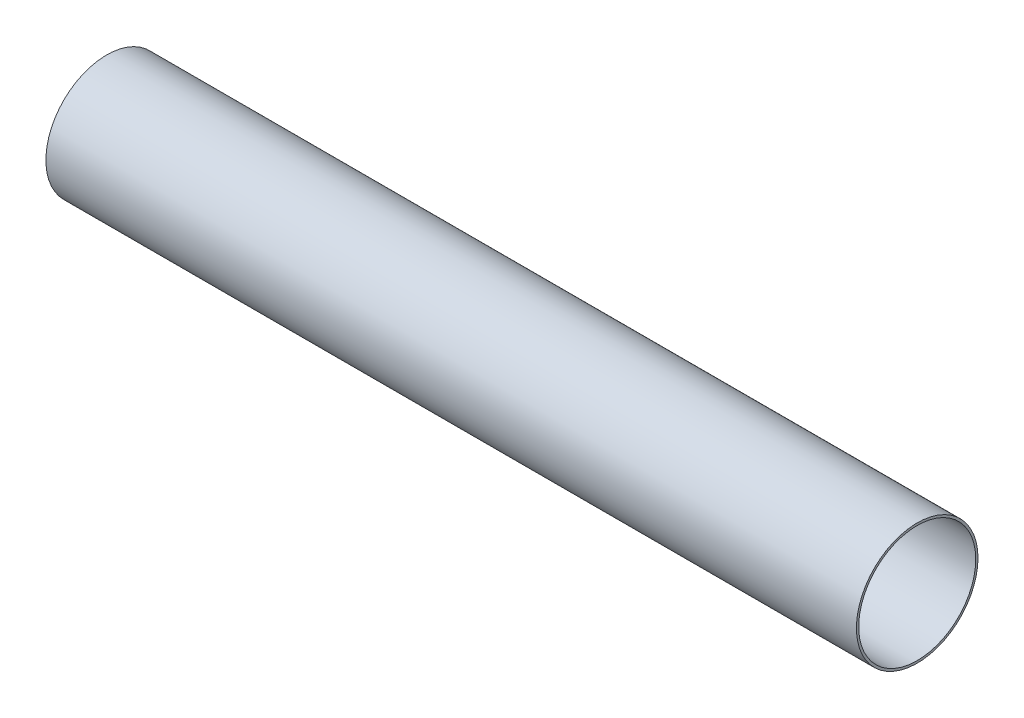
ISO-10303-21;
HEADER;
FILE_DESCRIPTION(('STEP AP214'),'2;1');
FILE_NAME('part.step','',(''),(''),'','','');
FILE_SCHEMA(('AUTOMOTIVE_DESIGN { 1 0 10303 214 1 1 1 1 }'));
ENDSEC;
DATA;
#1=APPLICATION_CONTEXT('core data for automotive mechanical design processes');
#2=APPLICATION_PROTOCOL_DEFINITION('international standard','automotive_design',2000,#1);
#3=PRODUCT_CONTEXT('',#1,'mechanical');
#4=PRODUCT('Part','Part','',(#3));
#5=PRODUCT_RELATED_PRODUCT_CATEGORY('part','',(#4));
#6=PRODUCT_DEFINITION_FORMATION('','',#4);
#7=PRODUCT_DEFINITION_CONTEXT('part definition',#1,'design');
#8=PRODUCT_DEFINITION('design','',#6,#7);
#9=PRODUCT_DEFINITION_SHAPE('','',#8);
#10=(LENGTH_UNIT() NAMED_UNIT(*) SI_UNIT(.MILLI.,.METRE.));
#11=(NAMED_UNIT(*) PLANE_ANGLE_UNIT() SI_UNIT($,.RADIAN.));
#12=(NAMED_UNIT(*) SI_UNIT($,.STERADIAN.) SOLID_ANGLE_UNIT());
#13=UNCERTAINTY_MEASURE_WITH_UNIT(LENGTH_MEASURE(1.E-05),#10,'distance_accuracy_value','');
#14=(GEOMETRIC_REPRESENTATION_CONTEXT(3) GLOBAL_UNCERTAINTY_ASSIGNED_CONTEXT((#13)) GLOBAL_UNIT_ASSIGNED_CONTEXT((#10,
#11,#12)) REPRESENTATION_CONTEXT('',''));
#15=CARTESIAN_POINT('',(0.,0.,0.));
#16=DIRECTION('',(0.,0.,1.));
#17=DIRECTION('',(1.,0.,0.));
#18=AXIS2_PLACEMENT_3D('',#15,#16,#17);
#19=CARTESIAN_POINT('',(127.,0.,0.));
#20=DIRECTION('',(1.,0.,0.));
#21=DIRECTION('',(0.,0.,-1.));
#22=AXIS2_PLACEMENT_3D('',#19,#20,#21);
#23=PLANE('',#22);
#24=CARTESIAN_POINT('',(127.,0.,0.));
#25=DIRECTION('',(1.,0.,0.));
#26=DIRECTION('',(0.,0.,-1.));
#27=AXIS2_PLACEMENT_3D('',#24,#25,#26);
#28=CIRCLE('',#27,19.05);
#29=CARTESIAN_POINT('',(127.,0.,-19.05));
#30=VERTEX_POINT('',#29);
#31=EDGE_CURVE('E10',#30,#30,#28,.T.);
#32=ORIENTED_EDGE('',*,*,#31,.T.);
#33=EDGE_LOOP('',(#32));
#34=FACE_BOUND('',#33,.T.);
#35=CARTESIAN_POINT('',(127.,0.,0.));
#36=DIRECTION('',(1.,0.,0.));
#37=DIRECTION('',(0.,0.,-1.));
#38=AXIS2_PLACEMENT_3D('',#35,#36,#37);
#39=CIRCLE('',#38,18.3388);
#40=CARTESIAN_POINT('',(127.,0.,-18.3388));
#41=VERTEX_POINT('',#40);
#42=EDGE_CURVE('E44',#41,#41,#39,.T.);
#43=ORIENTED_EDGE('',*,*,#42,.F.);
#44=EDGE_LOOP('',(#43));
#45=FACE_BOUND('',#44,.T.);
#46=ADVANCED_FACE('F33',(#34,#45),#23,.T.);
#47=CARTESIAN_POINT('',(-127.,0.,0.));
#48=DIRECTION('',(1.,0.,0.));
#49=DIRECTION('',(0.,0.,-1.));
#50=AXIS2_PLACEMENT_3D('',#47,#48,#49);
#51=PLANE('',#50);
#52=CARTESIAN_POINT('',(-127.,0.,0.));
#53=DIRECTION('',(1.,0.,0.));
#54=DIRECTION('',(0.,0.,-1.));
#55=AXIS2_PLACEMENT_3D('',#52,#53,#54);
#56=CIRCLE('',#55,19.05);
#57=CARTESIAN_POINT('',(-127.,0.,-19.05));
#58=VERTEX_POINT('',#57);
#59=EDGE_CURVE('E37',#58,#58,#56,.T.);
#60=ORIENTED_EDGE('',*,*,#59,.F.);
#61=EDGE_LOOP('',(#60));
#62=FACE_BOUND('',#61,.T.);
#63=CARTESIAN_POINT('',(-127.,0.,0.));
#64=DIRECTION('',(1.,0.,0.));
#65=DIRECTION('',(0.,0.,-1.));
#66=AXIS2_PLACEMENT_3D('',#63,#64,#65);
#67=CIRCLE('',#66,18.3388);
#68=CARTESIAN_POINT('',(-127.,0.,-18.3388));
#69=VERTEX_POINT('',#68);
#70=EDGE_CURVE('E46',#69,#69,#67,.T.);
#71=ORIENTED_EDGE('',*,*,#70,.T.);
#72=EDGE_LOOP('',(#71));
#73=FACE_BOUND('',#72,.T.);
#74=ADVANCED_FACE('F56',(#62,#73),#51,.F.);
#75=CARTESIAN_POINT('',(127.,0.,0.));
#76=DIRECTION('',(-1.,0.,0.));
#77=DIRECTION('',(0.,0.,1.));
#78=AXIS2_PLACEMENT_3D('',#75,#76,#77);
#79=CYLINDRICAL_SURFACE('',#78,19.05);
#80=ORIENTED_EDGE('',*,*,#31,.F.);
#81=EDGE_LOOP('',(#80));
#82=FACE_BOUND('',#81,.T.);
#83=ORIENTED_EDGE('',*,*,#59,.T.);
#84=EDGE_LOOP('',(#83));
#85=FACE_BOUND('',#84,.T.);
#86=ADVANCED_FACE('F35',(#82,#85),#79,.T.);
#87=CARTESIAN_POINT('',(127.,0.,0.));
#88=DIRECTION('',(-1.,0.,0.));
#89=DIRECTION('',(0.,0.,1.));
#90=AXIS2_PLACEMENT_3D('',#87,#88,#89);
#91=CYLINDRICAL_SURFACE('',#90,18.3388);
#92=ORIENTED_EDGE('',*,*,#42,.T.);
#93=EDGE_LOOP('',(#92));
#94=FACE_BOUND('',#93,.T.);
#95=ORIENTED_EDGE('',*,*,#70,.F.);
#96=EDGE_LOOP('',(#95));
#97=FACE_BOUND('',#96,.T.);
#98=ADVANCED_FACE('F52',(#94,#97),#91,.F.);
#99=CLOSED_SHELL('',(#46,#74,#86,#98));
#100=MANIFOLD_SOLID_BREP('B2',#99);
#101=ADVANCED_BREP_SHAPE_REPRESENTATION('',(#18,#100),#14);
#102=SHAPE_DEFINITION_REPRESENTATION(#9,#101);
ENDSEC;
END-ISO-10303-21;
